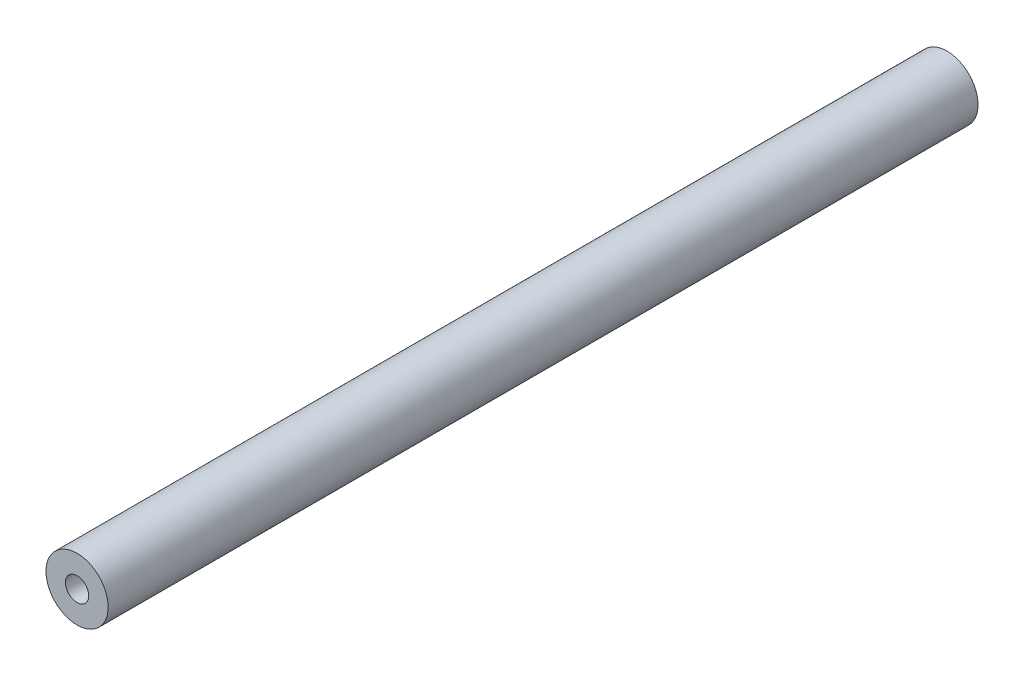
ISO-10303-21;
HEADER;
FILE_DESCRIPTION(('STEP AP214'),'2;1');
FILE_NAME('part.step','',(''),(''),'','','');
FILE_SCHEMA(('AUTOMOTIVE_DESIGN { 1 0 10303 214 1 1 1 1 }'));
ENDSEC;
DATA;
#1=APPLICATION_CONTEXT('core data for automotive mechanical design processes');
#2=APPLICATION_PROTOCOL_DEFINITION('international standard','automotive_design',2000,#1);
#3=PRODUCT_CONTEXT('',#1,'mechanical');
#4=PRODUCT('Part','Part','',(#3));
#5=PRODUCT_RELATED_PRODUCT_CATEGORY('part','',(#4));
#6=PRODUCT_DEFINITION_FORMATION('','',#4);
#7=PRODUCT_DEFINITION_CONTEXT('part definition',#1,'design');
#8=PRODUCT_DEFINITION('design','',#6,#7);
#9=PRODUCT_DEFINITION_SHAPE('','',#8);
#10=(LENGTH_UNIT() NAMED_UNIT(*) SI_UNIT(.MILLI.,.METRE.));
#11=(NAMED_UNIT(*) PLANE_ANGLE_UNIT() SI_UNIT($,.RADIAN.));
#12=(NAMED_UNIT(*) SI_UNIT($,.STERADIAN.) SOLID_ANGLE_UNIT());
#13=UNCERTAINTY_MEASURE_WITH_UNIT(LENGTH_MEASURE(1.E-05),#10,'distance_accuracy_value','');
#14=(GEOMETRIC_REPRESENTATION_CONTEXT(3) GLOBAL_UNCERTAINTY_ASSIGNED_CONTEXT((#13)) GLOBAL_UNIT_ASSIGNED_CONTEXT((#10,
#11,#12)) REPRESENTATION_CONTEXT('',''));
#15=CARTESIAN_POINT('',(0.,0.,0.));
#16=DIRECTION('',(0.,0.,1.));
#17=DIRECTION('',(1.,0.,0.));
#18=AXIS2_PLACEMENT_3D('',#15,#16,#17);
#19=CARTESIAN_POINT('',(0.,0.,202.));
#20=DIRECTION('',(0.,0.,-1.));
#21=DIRECTION('',(-1.,0.,0.));
#22=AXIS2_PLACEMENT_3D('',#19,#20,#21);
#23=PLANE('',#22);
#24=CARTESIAN_POINT('',(0.,0.,202.));
#25=DIRECTION('',(0.,0.,1.));
#26=DIRECTION('',(1.,0.,0.));
#27=AXIS2_PLACEMENT_3D('',#24,#25,#26);
#28=CIRCLE('',#27,2.5);
#29=CARTESIAN_POINT('',(2.5,0.,202.));
#30=VERTEX_POINT('',#29);
#31=EDGE_CURVE('E18',#30,#30,#28,.T.);
#32=ORIENTED_EDGE('',*,*,#31,.T.);
#33=EDGE_LOOP('',(#32));
#34=FACE_BOUND('',#33,.T.);
#35=ADVANCED_FACE('F15',(#34),#23,.F.);
#36=CARTESIAN_POINT('',(0.,0.,22.));
#37=DIRECTION('',(0.,0.,1.));
#38=DIRECTION('',(1.,0.,0.));
#39=AXIS2_PLACEMENT_3D('',#36,#37,#38);
#40=PLANE('',#39);
#41=CARTESIAN_POINT('',(0.,0.,22.));
#42=DIRECTION('',(0.,0.,-1.));
#43=DIRECTION('',(-1.,0.,0.));
#44=AXIS2_PLACEMENT_3D('',#41,#42,#43);
#45=CIRCLE('',#44,2.5);
#46=CARTESIAN_POINT('',(-2.5,0.,22.));
#47=VERTEX_POINT('',#46);
#48=EDGE_CURVE('E46',#47,#47,#45,.T.);
#49=ORIENTED_EDGE('',*,*,#48,.T.);
#50=EDGE_LOOP('',(#49));
#51=FACE_BOUND('',#50,.T.);
#52=ADVANCED_FACE('F58',(#51),#40,.F.);
#53=CARTESIAN_POINT('',(0.,0.,224.));
#54=DIRECTION('',(0.,0.,1.));
#55=DIRECTION('',(1.,0.,0.));
#56=AXIS2_PLACEMENT_3D('',#53,#54,#55);
#57=CYLINDRICAL_SURFACE('',#56,2.5);
#58=ORIENTED_EDGE('',*,*,#31,.F.);
#59=EDGE_LOOP('',(#58));
#60=FACE_BOUND('',#59,.T.);
#61=CARTESIAN_POINT('',(0.,0.,206.));
#62=DIRECTION('',(0.,0.,1.));
#63=DIRECTION('',(1.,0.,0.));
#64=AXIS2_PLACEMENT_3D('',#61,#62,#63);
#65=CIRCLE('',#64,2.5);
#66=CARTESIAN_POINT('',(2.5,0.,206.));
#67=VERTEX_POINT('',#66);
#68=EDGE_CURVE('E44',#67,#67,#65,.T.);
#69=ORIENTED_EDGE('',*,*,#68,.T.);
#70=EDGE_LOOP('',(#69));
#71=FACE_BOUND('',#70,.T.);
#72=ADVANCED_FACE('F54',(#60,#71),#57,.F.);
#73=CARTESIAN_POINT('',(0.,0.,0.));
#74=DIRECTION('',(0.,0.,-1.));
#75=DIRECTION('',(-1.,0.,0.));
#76=AXIS2_PLACEMENT_3D('',#73,#74,#75);
#77=CYLINDRICAL_SURFACE('',#76,2.5);
#78=ORIENTED_EDGE('',*,*,#48,.F.);
#79=EDGE_LOOP('',(#78));
#80=FACE_BOUND('',#79,.T.);
#81=CARTESIAN_POINT('',(0.,0.,18.));
#82=DIRECTION('',(0.,0.,-1.));
#83=DIRECTION('',(-1.,0.,0.));
#84=AXIS2_PLACEMENT_3D('',#81,#82,#83);
#85=CIRCLE('',#84,2.5);
#86=CARTESIAN_POINT('',(-2.5,0.,18.));
#87=VERTEX_POINT('',#86);
#88=EDGE_CURVE('E41',#87,#87,#85,.T.);
#89=ORIENTED_EDGE('',*,*,#88,.T.);
#90=EDGE_LOOP('',(#89));
#91=FACE_BOUND('',#90,.T.);
#92=ADVANCED_FACE('F57',(#80,#91),#77,.F.);
#93=CARTESIAN_POINT('',(2.5,0.,206.));
#94=DIRECTION('',(0.,0.,-1.));
#95=DIRECTION('',(-1.,0.,0.));
#96=AXIS2_PLACEMENT_3D('',#93,#94,#95);
#97=PLANE('',#96);
#98=CARTESIAN_POINT('',(0.,0.,206.));
#99=DIRECTION('',(0.,0.,1.));
#100=DIRECTION('',(1.,0.,0.));
#101=AXIS2_PLACEMENT_3D('',#98,#99,#100);
#102=CIRCLE('',#101,3.);
#103=CARTESIAN_POINT('',(3.,0.,206.));
#104=VERTEX_POINT('',#103);
#105=EDGE_CURVE('E38',#104,#104,#102,.T.);
#106=ORIENTED_EDGE('',*,*,#105,.T.);
#107=EDGE_LOOP('',(#106));
#108=FACE_BOUND('',#107,.T.);
#109=ORIENTED_EDGE('',*,*,#68,.F.);
#110=EDGE_LOOP('',(#109));
#111=FACE_BOUND('',#110,.T.);
#112=ADVANCED_FACE('F62',(#108,#111),#97,.F.);
#113=CARTESIAN_POINT('',(2.5,0.,18.));
#114=DIRECTION('',(0.,0.,1.));
#115=DIRECTION('',(1.,0.,0.));
#116=AXIS2_PLACEMENT_3D('',#113,#114,#115);
#117=PLANE('',#116);
#118=CARTESIAN_POINT('',(0.,0.,18.));
#119=DIRECTION('',(0.,0.,-1.));
#120=DIRECTION('',(-1.,0.,0.));
#121=AXIS2_PLACEMENT_3D('',#118,#119,#120);
#122=CIRCLE('',#121,3.);
#123=CARTESIAN_POINT('',(-3.,0.,18.));
#124=VERTEX_POINT('',#123);
#125=EDGE_CURVE('E35',#124,#124,#122,.T.);
#126=ORIENTED_EDGE('',*,*,#125,.T.);
#127=EDGE_LOOP('',(#126));
#128=FACE_BOUND('',#127,.T.);
#129=ORIENTED_EDGE('',*,*,#88,.F.);
#130=EDGE_LOOP('',(#129));
#131=FACE_BOUND('',#130,.T.);
#132=ADVANCED_FACE('F64',(#128,#131),#117,.F.);
#133=CARTESIAN_POINT('',(0.,0.,224.));
#134=DIRECTION('',(0.,0.,1.));
#135=DIRECTION('',(1.,0.,0.));
#136=AXIS2_PLACEMENT_3D('',#133,#134,#135);
#137=CYLINDRICAL_SURFACE('',#136,3.);
#138=CARTESIAN_POINT('',(0.,0.,224.));
#139=DIRECTION('',(0.,0.,1.));
#140=DIRECTION('',(1.,0.,0.));
#141=AXIS2_PLACEMENT_3D('',#138,#139,#140);
#142=CIRCLE('',#141,3.);
#143=CARTESIAN_POINT('',(3.,0.,224.));
#144=VERTEX_POINT('',#143);
#145=EDGE_CURVE('E32',#144,#144,#142,.F.);
#146=ORIENTED_EDGE('',*,*,#145,.F.);
#147=EDGE_LOOP('',(#146));
#148=FACE_BOUND('',#147,.T.);
#149=ORIENTED_EDGE('',*,*,#105,.F.);
#150=EDGE_LOOP('',(#149));
#151=FACE_BOUND('',#150,.T.);
#152=ADVANCED_FACE('F72',(#148,#151),#137,.F.);
#153=CARTESIAN_POINT('',(0.,0.,0.));
#154=DIRECTION('',(0.,0.,-1.));
#155=DIRECTION('',(-1.,0.,0.));
#156=AXIS2_PLACEMENT_3D('',#153,#154,#155);
#157=CYLINDRICAL_SURFACE('',#156,3.);
#158=ORIENTED_EDGE('',*,*,#125,.F.);
#159=EDGE_LOOP('',(#158));
#160=FACE_BOUND('',#159,.T.);
#161=CARTESIAN_POINT('',(0.,0.,0.));
#162=DIRECTION('',(0.,0.,-1.));
#163=DIRECTION('',(-1.,0.,0.));
#164=AXIS2_PLACEMENT_3D('',#161,#162,#163);
#165=CIRCLE('',#164,3.);
#166=CARTESIAN_POINT('',(-3.,0.,0.));
#167=VERTEX_POINT('',#166);
#168=EDGE_CURVE('E27',#167,#167,#165,.T.);
#169=ORIENTED_EDGE('',*,*,#168,.T.);
#170=EDGE_LOOP('',(#169));
#171=FACE_BOUND('',#170,.T.);
#172=ADVANCED_FACE('F91',(#160,#171),#157,.F.);
#173=CARTESIAN_POINT('',(0.,0.,224.));
#174=DIRECTION('',(0.,0.,1.));
#175=DIRECTION('',(1.,0.,0.));
#176=AXIS2_PLACEMENT_3D('',#173,#174,#175);
#177=PLANE('',#176);
#178=CARTESIAN_POINT('',(0.,0.,224.));
#179=DIRECTION('',(0.,0.,-1.));
#180=DIRECTION('',(-1.,0.,0.));
#181=AXIS2_PLACEMENT_3D('',#178,#179,#180);
#182=CIRCLE('',#181,8.);
#183=CARTESIAN_POINT('',(-8.,0.,224.));
#184=VERTEX_POINT('',#183);
#185=EDGE_CURVE('E22',#184,#184,#182,.T.);
#186=ORIENTED_EDGE('',*,*,#185,.F.);
#187=EDGE_LOOP('',(#186));
#188=FACE_BOUND('',#187,.T.);
#189=ORIENTED_EDGE('',*,*,#145,.T.);
#190=EDGE_LOOP('',(#189));
#191=FACE_BOUND('',#190,.T.);
#192=ADVANCED_FACE('F84',(#188,#191),#177,.T.);
#193=CARTESIAN_POINT('',(0.,0.,0.));
#194=DIRECTION('',(0.,0.,1.));
#195=DIRECTION('',(1.,0.,0.));
#196=AXIS2_PLACEMENT_3D('',#193,#194,#195);
#197=PLANE('',#196);
#198=CARTESIAN_POINT('',(0.,0.,0.));
#199=DIRECTION('',(0.,0.,-1.));
#200=DIRECTION('',(-1.,0.,0.));
#201=AXIS2_PLACEMENT_3D('',#198,#199,#200);
#202=CIRCLE('',#201,8.);
#203=CARTESIAN_POINT('',(-8.,0.,0.));
#204=VERTEX_POINT('',#203);
#205=EDGE_CURVE('E10',#204,#204,#202,.F.);
#206=ORIENTED_EDGE('',*,*,#205,.F.);
#207=EDGE_LOOP('',(#206));
#208=FACE_BOUND('',#207,.T.);
#209=ORIENTED_EDGE('',*,*,#168,.F.);
#210=EDGE_LOOP('',(#209));
#211=FACE_BOUND('',#210,.T.);
#212=ADVANCED_FACE('F79',(#208,#211),#197,.F.);
#213=CARTESIAN_POINT('',(0.,0.,224.));
#214=DIRECTION('',(0.,0.,-1.));
#215=DIRECTION('',(-1.,0.,0.));
#216=AXIS2_PLACEMENT_3D('',#213,#214,#215);
#217=CYLINDRICAL_SURFACE('',#216,8.);
#218=ORIENTED_EDGE('',*,*,#205,.T.);
#219=EDGE_LOOP('',(#218));
#220=FACE_BOUND('',#219,.T.);
#221=ORIENTED_EDGE('',*,*,#185,.T.);
#222=EDGE_LOOP('',(#221));
#223=FACE_BOUND('',#222,.T.);
#224=ADVANCED_FACE('F77',(#220,#223),#217,.T.);
#225=CLOSED_SHELL('',(#35,#52,#72,#92,#112,#132,#152,#172,#192,#212,#224));
#226=MANIFOLD_SOLID_BREP('B1',#225);
#227=ADVANCED_BREP_SHAPE_REPRESENTATION('',(#18,#226),#14);
#228=SHAPE_DEFINITION_REPRESENTATION(#9,#227);
ENDSEC;
END-ISO-10303-21;
